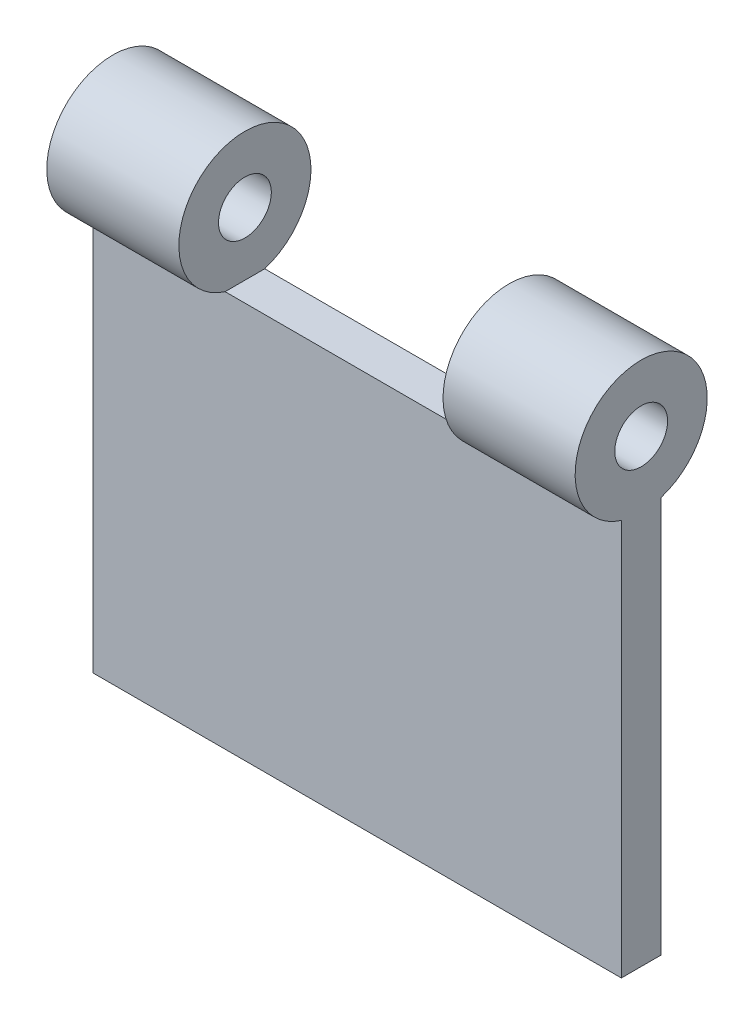
ISO-10303-21;
HEADER;
FILE_DESCRIPTION(('STEP AP214'),'2;1');
FILE_NAME('part.step','',(''),(''),'','','');
FILE_SCHEMA(('AUTOMOTIVE_DESIGN { 1 0 10303 214 1 1 1 1 }'));
ENDSEC;
DATA;
#1=APPLICATION_CONTEXT('core data for automotive mechanical design processes');
#2=APPLICATION_PROTOCOL_DEFINITION('international standard','automotive_design',2000,#1);
#3=PRODUCT_CONTEXT('',#1,'mechanical');
#4=PRODUCT('Part','Part','',(#3));
#5=PRODUCT_RELATED_PRODUCT_CATEGORY('part','',(#4));
#6=PRODUCT_DEFINITION_FORMATION('','',#4);
#7=PRODUCT_DEFINITION_CONTEXT('part definition',#1,'design');
#8=PRODUCT_DEFINITION('design','',#6,#7);
#9=PRODUCT_DEFINITION_SHAPE('','',#8);
#10=(LENGTH_UNIT() NAMED_UNIT(*) SI_UNIT(.MILLI.,.METRE.));
#11=(NAMED_UNIT(*) PLANE_ANGLE_UNIT() SI_UNIT($,.RADIAN.));
#12=(NAMED_UNIT(*) SI_UNIT($,.STERADIAN.) SOLID_ANGLE_UNIT());
#13=UNCERTAINTY_MEASURE_WITH_UNIT(LENGTH_MEASURE(1.E-05),#10,'distance_accuracy_value','');
#14=(GEOMETRIC_REPRESENTATION_CONTEXT(3) GLOBAL_UNCERTAINTY_ASSIGNED_CONTEXT((#13)) GLOBAL_UNIT_ASSIGNED_CONTEXT((#10,
#11,#12)) REPRESENTATION_CONTEXT('',''));
#15=CARTESIAN_POINT('',(0.,0.,0.));
#16=DIRECTION('',(0.,0.,1.));
#17=DIRECTION('',(1.,0.,0.));
#18=AXIS2_PLACEMENT_3D('',#15,#16,#17);
#19=CARTESIAN_POINT('',(20.,26.6883404936536,0.));
#20=DIRECTION('',(-1.,0.,0.));
#21=DIRECTION('',(0.,0.,1.));
#22=AXIS2_PLACEMENT_3D('',#19,#20,#21);
#23=CYLINDRICAL_SURFACE('',#22,5.);
#24=CARTESIAN_POINT('',(-10.,26.6883404936536,0.));
#25=DIRECTION('',(1.,0.,0.));
#26=DIRECTION('',(0.,0.,-1.));
#27=AXIS2_PLACEMENT_3D('',#24,#25,#26);
#28=CIRCLE('',#27,5.);
#29=CARTESIAN_POINT('',(-10.,21.9186444865688,-1.5));
#30=VERTEX_POINT('',#29);
#31=CARTESIAN_POINT('',(-10.,21.9186444865688,1.5));
#32=VERTEX_POINT('',#31);
#33=EDGE_CURVE('E96',#30,#32,#28,.T.);
#34=ORIENTED_EDGE('',*,*,#33,.F.);
#35=DIRECTION('',(-1.,0.,0.));
#36=VECTOR('',#35,1.);
#37=CARTESIAN_POINT('',(20.,21.9186444865688,-1.5));
#38=LINE('',#37,#36);
#39=CARTESIAN_POINT('',(-20.,21.9186444865688,-1.5));
#40=VERTEX_POINT('',#39);
#41=EDGE_CURVE('E80',#30,#40,#38,.T.);
#42=ORIENTED_EDGE('',*,*,#41,.T.);
#43=CARTESIAN_POINT('',(-20.,26.6883404936536,0.));
#44=DIRECTION('',(1.,0.,0.));
#45=DIRECTION('',(0.,0.,-1.));
#46=AXIS2_PLACEMENT_3D('',#43,#44,#45);
#47=CIRCLE('',#46,5.);
#48=CARTESIAN_POINT('',(-20.,21.9186444865688,1.5));
#49=VERTEX_POINT('',#48);
#50=EDGE_CURVE('E109',#40,#49,#47,.T.);
#51=ORIENTED_EDGE('',*,*,#50,.T.);
#52=DIRECTION('',(-1.,0.,0.));
#53=VECTOR('',#52,1.);
#54=CARTESIAN_POINT('',(20.,21.9186444865688,1.5));
#55=LINE('',#54,#53);
#56=EDGE_CURVE('E42',#32,#49,#55,.T.);
#57=ORIENTED_EDGE('',*,*,#56,.F.);
#58=EDGE_LOOP('',(#34,#42,#51,#57));
#59=FACE_BOUND('',#58,.T.);
#60=ADVANCED_FACE('F34',(#59),#23,.T.);
#61=CARTESIAN_POINT('',(20.,26.6883404936536,0.));
#62=DIRECTION('',(-1.,0.,0.));
#63=DIRECTION('',(0.,0.,1.));
#64=AXIS2_PLACEMENT_3D('',#61,#62,#63);
#65=CYLINDRICAL_SURFACE('',#64,2.);
#66=CARTESIAN_POINT('',(-20.,26.6883404936536,0.));
#67=DIRECTION('',(1.,0.,0.));
#68=DIRECTION('',(0.,0.,-1.));
#69=AXIS2_PLACEMENT_3D('',#66,#67,#68);
#70=CIRCLE('',#69,2.);
#71=CARTESIAN_POINT('',(-20.,26.6883404936536,-2.));
#72=VERTEX_POINT('',#71);
#73=EDGE_CURVE('E115',#72,#72,#70,.T.);
#74=ORIENTED_EDGE('',*,*,#73,.F.);
#75=EDGE_LOOP('',(#74));
#76=FACE_BOUND('',#75,.T.);
#77=CARTESIAN_POINT('',(-10.,26.6883404936536,0.));
#78=DIRECTION('',(1.,0.,0.));
#79=DIRECTION('',(0.,0.,-1.));
#80=AXIS2_PLACEMENT_3D('',#77,#78,#79);
#81=CIRCLE('',#80,2.);
#82=CARTESIAN_POINT('',(-10.,26.6883404936536,-2.));
#83=VERTEX_POINT('',#82);
#84=EDGE_CURVE('E239',#83,#83,#81,.T.);
#85=ORIENTED_EDGE('',*,*,#84,.T.);
#86=EDGE_LOOP('',(#85));
#87=FACE_BOUND('',#86,.T.);
#88=ADVANCED_FACE('F160',(#76,#87),#65,.F.);
#89=CARTESIAN_POINT('',(20.,26.6883404936536,0.));
#90=DIRECTION('',(1.,0.,0.));
#91=DIRECTION('',(0.,0.,-1.));
#92=AXIS2_PLACEMENT_3D('',#89,#90,#91);
#93=PLANE('',#92);
#94=CARTESIAN_POINT('',(20.,26.6883404936536,0.));
#95=DIRECTION('',(1.,0.,0.));
#96=DIRECTION('',(0.,0.,-1.));
#97=AXIS2_PLACEMENT_3D('',#94,#95,#96);
#98=CIRCLE('',#97,5.);
#99=CARTESIAN_POINT('',(20.,21.9186444865688,-1.5));
#100=VERTEX_POINT('',#99);
#101=CARTESIAN_POINT('',(20.,21.9186444865688,1.5));
#102=VERTEX_POINT('',#101);
#103=EDGE_CURVE('E124',#100,#102,#98,.T.);
#104=ORIENTED_EDGE('',*,*,#103,.T.);
#105=DIRECTION('',(0.,-1.,0.));
#106=VECTOR('',#105,1.);
#107=CARTESIAN_POINT('',(20.,21.9186444865688,1.5));
#108=LINE('',#107,#106);
#109=CARTESIAN_POINT('',(20.,-8.08135551343116,1.5));
#110=VERTEX_POINT('',#109);
#111=EDGE_CURVE('E87',#102,#110,#108,.T.);
#112=ORIENTED_EDGE('',*,*,#111,.T.);
#113=DIRECTION('',(0.,0.,-1.));
#114=VECTOR('',#113,1.);
#115=CARTESIAN_POINT('',(20.,-8.08135551343116,1.5));
#116=LINE('',#115,#114);
#117=CARTESIAN_POINT('',(20.,-8.08135551343116,-1.5));
#118=VERTEX_POINT('',#117);
#119=EDGE_CURVE('E128',#110,#118,#116,.T.);
#120=ORIENTED_EDGE('',*,*,#119,.T.);
#121=DIRECTION('',(0.,1.,0.));
#122=VECTOR('',#121,1.);
#123=CARTESIAN_POINT('',(20.,21.9186444865688,-1.5));
#124=LINE('',#123,#122);
#125=EDGE_CURVE('E58',#118,#100,#124,.T.);
#126=ORIENTED_EDGE('',*,*,#125,.T.);
#127=EDGE_LOOP('',(#104,#112,#120,#126));
#128=FACE_BOUND('',#127,.T.);
#129=CARTESIAN_POINT('',(20.,26.6883404936536,0.));
#130=DIRECTION('',(1.,0.,0.));
#131=DIRECTION('',(0.,0.,-1.));
#132=AXIS2_PLACEMENT_3D('',#129,#130,#131);
#133=CIRCLE('',#132,2.);
#134=CARTESIAN_POINT('',(20.,26.6883404936536,-2.));
#135=VERTEX_POINT('',#134);
#136=EDGE_CURVE('E119',#135,#135,#133,.T.);
#137=ORIENTED_EDGE('',*,*,#136,.F.);
#138=EDGE_LOOP('',(#137));
#139=FACE_BOUND('',#138,.T.);
#140=ADVANCED_FACE('F157',(#128,#139),#93,.T.);
#141=CARTESIAN_POINT('',(-20.,26.6883404936536,0.));
#142=DIRECTION('',(1.,0.,0.));
#143=DIRECTION('',(0.,0.,-1.));
#144=AXIS2_PLACEMENT_3D('',#141,#142,#143);
#145=PLANE('',#144);
#146=ORIENTED_EDGE('',*,*,#50,.F.);
#147=DIRECTION('',(0.,1.,0.));
#148=VECTOR('',#147,1.);
#149=CARTESIAN_POINT('',(-20.,21.9186444865688,-1.5));
#150=LINE('',#149,#148);
#151=CARTESIAN_POINT('',(-20.,-8.08135551343116,-1.5));
#152=VERTEX_POINT('',#151);
#153=EDGE_CURVE('E126',#152,#40,#150,.T.);
#154=ORIENTED_EDGE('',*,*,#153,.F.);
#155=DIRECTION('',(0.,0.,-1.));
#156=VECTOR('',#155,1.);
#157=CARTESIAN_POINT('',(-20.,-8.08135551343116,1.5));
#158=LINE('',#157,#156);
#159=CARTESIAN_POINT('',(-20.,-8.08135551343116,1.5));
#160=VERTEX_POINT('',#159);
#161=EDGE_CURVE('E134',#160,#152,#158,.T.);
#162=ORIENTED_EDGE('',*,*,#161,.F.);
#163=DIRECTION('',(0.,-1.,0.));
#164=VECTOR('',#163,1.);
#165=CARTESIAN_POINT('',(-20.,21.9186444865688,1.5));
#166=LINE('',#165,#164);
#167=EDGE_CURVE('E132',#49,#160,#166,.T.);
#168=ORIENTED_EDGE('',*,*,#167,.F.);
#169=EDGE_LOOP('',(#146,#154,#162,#168));
#170=FACE_BOUND('',#169,.T.);
#171=ORIENTED_EDGE('',*,*,#73,.T.);
#172=EDGE_LOOP('',(#171));
#173=FACE_BOUND('',#172,.T.);
#174=ADVANCED_FACE('F150',(#170,#173),#145,.F.);
#175=CARTESIAN_POINT('',(10.,21.9186444865688,-1.5));
#176=VERTEX_POINT('',#175);
#177=EDGE_CURVE('E137',#100,#176,#38,.T.);
#178=ORIENTED_EDGE('',*,*,#177,.T.);
#179=CARTESIAN_POINT('',(10.,26.6883404936536,0.));
#180=DIRECTION('',(1.,0.,0.));
#181=DIRECTION('',(0.,0.,-1.));
#182=AXIS2_PLACEMENT_3D('',#179,#180,#181);
#183=CIRCLE('',#182,5.);
#184=CARTESIAN_POINT('',(10.,21.9186444865688,1.5));
#185=VERTEX_POINT('',#184);
#186=EDGE_CURVE('E238',#176,#185,#183,.T.);
#187=ORIENTED_EDGE('',*,*,#186,.T.);
#188=EDGE_CURVE('E11',#102,#185,#55,.T.);
#189=ORIENTED_EDGE('',*,*,#188,.F.);
#190=ORIENTED_EDGE('',*,*,#103,.F.);
#191=EDGE_LOOP('',(#178,#187,#189,#190));
#192=FACE_BOUND('',#191,.T.);
#193=ADVANCED_FACE('F36',(#192),#23,.T.);
#194=CARTESIAN_POINT('',(20.,21.9186444865688,1.5));
#195=DIRECTION('',(0.,0.,-1.));
#196=DIRECTION('',(0.,1.,0.));
#197=AXIS2_PLACEMENT_3D('',#194,#195,#196);
#198=PLANE('',#197);
#199=ORIENTED_EDGE('',*,*,#167,.T.);
#200=DIRECTION('',(-1.,0.,0.));
#201=VECTOR('',#200,1.);
#202=CARTESIAN_POINT('',(20.,-8.08135551343116,1.5));
#203=LINE('',#202,#201);
#204=EDGE_CURVE('E111',#110,#160,#203,.T.);
#205=ORIENTED_EDGE('',*,*,#204,.F.);
#206=ORIENTED_EDGE('',*,*,#111,.F.);
#207=ORIENTED_EDGE('',*,*,#188,.T.);
#208=DIRECTION('',(1.,0.,0.));
#209=VECTOR('',#208,1.);
#210=CARTESIAN_POINT('',(-10.,21.9186444865688,1.5));
#211=LINE('',#210,#209);
#212=EDGE_CURVE('E104',#32,#185,#211,.T.);
#213=ORIENTED_EDGE('',*,*,#212,.F.);
#214=ORIENTED_EDGE('',*,*,#56,.T.);
#215=EDGE_LOOP('',(#199,#205,#206,#207,#213,#214));
#216=FACE_BOUND('',#215,.T.);
#217=ADVANCED_FACE('F112',(#216),#198,.F.);
#218=CARTESIAN_POINT('',(20.,-8.08135551343116,1.5));
#219=DIRECTION('',(0.,1.,0.));
#220=DIRECTION('',(0.,0.,1.));
#221=AXIS2_PLACEMENT_3D('',#218,#219,#220);
#222=PLANE('',#221);
#223=ORIENTED_EDGE('',*,*,#161,.T.);
#224=DIRECTION('',(-1.,0.,0.));
#225=VECTOR('',#224,1.);
#226=CARTESIAN_POINT('',(20.,-8.08135551343116,-1.5));
#227=LINE('',#226,#225);
#228=EDGE_CURVE('E140',#118,#152,#227,.T.);
#229=ORIENTED_EDGE('',*,*,#228,.F.);
#230=ORIENTED_EDGE('',*,*,#119,.F.);
#231=ORIENTED_EDGE('',*,*,#204,.T.);
#232=EDGE_LOOP('',(#223,#229,#230,#231));
#233=FACE_BOUND('',#232,.T.);
#234=ADVANCED_FACE('F146',(#233),#222,.F.);
#235=CARTESIAN_POINT('',(20.,21.9186444865688,-1.5));
#236=DIRECTION('',(0.,0.,1.));
#237=DIRECTION('',(0.,-1.,0.));
#238=AXIS2_PLACEMENT_3D('',#235,#236,#237);
#239=PLANE('',#238);
#240=ORIENTED_EDGE('',*,*,#153,.T.);
#241=ORIENTED_EDGE('',*,*,#41,.F.);
#242=DIRECTION('',(1.,0.,0.));
#243=VECTOR('',#242,1.);
#244=CARTESIAN_POINT('',(-10.,21.9186444865688,-1.5));
#245=LINE('',#244,#243);
#246=EDGE_CURVE('E106',#30,#176,#245,.T.);
#247=ORIENTED_EDGE('',*,*,#246,.T.);
#248=ORIENTED_EDGE('',*,*,#177,.F.);
#249=ORIENTED_EDGE('',*,*,#125,.F.);
#250=ORIENTED_EDGE('',*,*,#228,.T.);
#251=EDGE_LOOP('',(#240,#241,#247,#248,#249,#250));
#252=FACE_BOUND('',#251,.T.);
#253=ADVANCED_FACE('F153',(#252),#239,.F.);
#254=CARTESIAN_POINT('',(10.,26.6883404936536,0.));
#255=DIRECTION('',(1.,0.,0.));
#256=DIRECTION('',(0.,0.,-1.));
#257=AXIS2_PLACEMENT_3D('',#254,#255,#256);
#258=CIRCLE('',#257,2.);
#259=CARTESIAN_POINT('',(10.,26.6883404936536,-2.));
#260=VERTEX_POINT('',#259);
#261=EDGE_CURVE('E237',#260,#260,#258,.T.);
#262=ORIENTED_EDGE('',*,*,#261,.F.);
#263=EDGE_LOOP('',(#262));
#264=FACE_BOUND('',#263,.T.);
#265=ORIENTED_EDGE('',*,*,#136,.T.);
#266=EDGE_LOOP('',(#265));
#267=FACE_BOUND('',#266,.T.);
#268=ADVANCED_FACE('F164',(#264,#267),#65,.F.);
#269=CARTESIAN_POINT('',(-10.,21.9186444865688,-1.5));
#270=DIRECTION('',(0.,-1.,0.));
#271=DIRECTION('',(0.,0.,-1.));
#272=AXIS2_PLACEMENT_3D('',#269,#270,#271);
#273=PLANE('',#272);
#274=DIRECTION('',(0.,0.,-1.));
#275=VECTOR('',#274,1.);
#276=CARTESIAN_POINT('',(10.,21.9186444865688,-1.5));
#277=LINE('',#276,#275);
#278=EDGE_CURVE('E49',#185,#176,#277,.T.);
#279=ORIENTED_EDGE('',*,*,#278,.T.);
#280=ORIENTED_EDGE('',*,*,#246,.F.);
#281=DIRECTION('',(0.,0.,-1.));
#282=VECTOR('',#281,1.);
#283=CARTESIAN_POINT('',(-10.,21.9186444865688,-1.5));
#284=LINE('',#283,#282);
#285=EDGE_CURVE('E99',#32,#30,#284,.T.);
#286=ORIENTED_EDGE('',*,*,#285,.F.);
#287=ORIENTED_EDGE('',*,*,#212,.T.);
#288=EDGE_LOOP('',(#279,#280,#286,#287));
#289=FACE_BOUND('',#288,.T.);
#290=ADVANCED_FACE('F102',(#289),#273,.F.);
#291=CARTESIAN_POINT('',(-10.,26.6883404936536,0.));
#292=DIRECTION('',(1.,0.,0.));
#293=DIRECTION('',(0.,0.,-1.));
#294=AXIS2_PLACEMENT_3D('',#291,#292,#293);
#295=PLANE('',#294);
#296=ORIENTED_EDGE('',*,*,#84,.F.);
#297=EDGE_LOOP('',(#296));
#298=FACE_BOUND('',#297,.T.);
#299=ORIENTED_EDGE('',*,*,#33,.T.);
#300=ORIENTED_EDGE('',*,*,#285,.T.);
#301=EDGE_LOOP('',(#299,#300));
#302=FACE_BOUND('',#301,.T.);
#303=ADVANCED_FACE('F98',(#298,#302),#295,.T.);
#304=CARTESIAN_POINT('',(10.,26.6883404936536,0.));
#305=DIRECTION('',(1.,0.,0.));
#306=DIRECTION('',(0.,0.,-1.));
#307=AXIS2_PLACEMENT_3D('',#304,#305,#306);
#308=PLANE('',#307);
#309=ORIENTED_EDGE('',*,*,#261,.T.);
#310=EDGE_LOOP('',(#309));
#311=FACE_BOUND('',#310,.T.);
#312=ORIENTED_EDGE('',*,*,#186,.F.);
#313=ORIENTED_EDGE('',*,*,#278,.F.);
#314=EDGE_LOOP('',(#312,#313));
#315=FACE_BOUND('',#314,.T.);
#316=ADVANCED_FACE('F221',(#311,#315),#308,.F.);
#317=CLOSED_SHELL('',(#60,#88,#140,#174,#193,#217,#234,#253,#268,#290,#303,#316));
#318=MANIFOLD_SOLID_BREP('B2',#317);
#319=ADVANCED_BREP_SHAPE_REPRESENTATION('',(#18,#318),#14);
#320=SHAPE_DEFINITION_REPRESENTATION(#9,#319);
ENDSEC;
END-ISO-10303-21;
